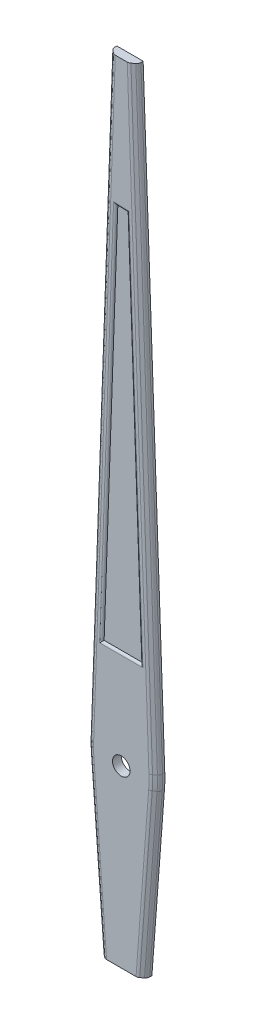
ISO-10303-21;
HEADER;
FILE_DESCRIPTION(('STEP AP214'),'2;1');
FILE_NAME('part.step','',(''),(''),'','','');
FILE_SCHEMA(('AUTOMOTIVE_DESIGN { 1 0 10303 214 1 1 1 1 }'));
ENDSEC;
DATA;
#1=APPLICATION_CONTEXT('core data for automotive mechanical design processes');
#2=APPLICATION_PROTOCOL_DEFINITION('international standard','automotive_design',2000,#1);
#3=PRODUCT_CONTEXT('',#1,'mechanical');
#4=PRODUCT('Part','Part','',(#3));
#5=PRODUCT_RELATED_PRODUCT_CATEGORY('part','',(#4));
#6=PRODUCT_DEFINITION_FORMATION('','',#4);
#7=PRODUCT_DEFINITION_CONTEXT('part definition',#1,'design');
#8=PRODUCT_DEFINITION('design','',#6,#7);
#9=PRODUCT_DEFINITION_SHAPE('','',#8);
#10=(LENGTH_UNIT() NAMED_UNIT(*) SI_UNIT(.MILLI.,.METRE.));
#11=(NAMED_UNIT(*) PLANE_ANGLE_UNIT() SI_UNIT($,.RADIAN.));
#12=(NAMED_UNIT(*) SI_UNIT($,.STERADIAN.) SOLID_ANGLE_UNIT());
#13=UNCERTAINTY_MEASURE_WITH_UNIT(LENGTH_MEASURE(1.E-05),#10,'distance_accuracy_value','');
#14=(GEOMETRIC_REPRESENTATION_CONTEXT(3) GLOBAL_UNCERTAINTY_ASSIGNED_CONTEXT((#13)) GLOBAL_UNIT_ASSIGNED_CONTEXT((#10,
#11,#12)) REPRESENTATION_CONTEXT('',''));
#15=CARTESIAN_POINT('',(0.,0.,0.));
#16=DIRECTION('',(0.,0.,1.));
#17=DIRECTION('',(1.,0.,0.));
#18=AXIS2_PLACEMENT_3D('',#15,#16,#17);
#19=CARTESIAN_POINT('',(-2.20401362734664,0.058827208974585,0.2));
#20=DIRECTION('',(0.,0.,1.));
#21=DIRECTION('',(1.,0.,0.));
#22=AXIS2_PLACEMENT_3D('',#19,#20,#21);
#23=PLANE('',#22);
#24=DIRECTION('',(-0.0356915305124125,-0.99936285434755,0.));
#25=VECTOR('',#24,1.);
#26=CARTESIAN_POINT('',(-0.177800696297226,11.0336739066205,0.2));
#27=LINE('',#26,#25);
#28=CARTESIAN_POINT('',(-0.493646192962242,2.19,0.2));
#29=VERTEX_POINT('',#28);
#30=CARTESIAN_POINT('',(-0.176016119771606,11.0836420493378,0.2));
#31=VERTEX_POINT('',#30);
#32=EDGE_CURVE('E366',#29,#31,#27,.F.);
#33=ORIENTED_EDGE('',*,*,#32,.T.);
#34=DIRECTION('',(-0.99936285434755,0.0356915305124137,0.));
#35=VECTOR('',#34,1.);
#36=CARTESIAN_POINT('',(0.129943650037985,11.0727149147018,0.2));
#37=LINE('',#36,#35);
#38=CARTESIAN_POINT('',(0.176465713947268,11.0710534124193,0.2));
#39=VERTEX_POINT('',#38);
#40=EDGE_CURVE('E11',#31,#39,#37,.F.);
#41=ORIENTED_EDGE('',*,*,#40,.T.);
#42=DIRECTION('',(-0.0356915305124124,0.99936285434755,0.));
#43=VECTOR('',#42,1.);
#44=CARTESIAN_POINT('',(0.491796743800613,2.24178457652562,0.2));
#45=LINE('',#44,#43);
#46=CARTESIAN_POINT('',(0.493646192962242,2.19,0.2));
#47=VERTEX_POINT('',#46);
#48=EDGE_CURVE('E45',#39,#47,#45,.F.);
#49=ORIENTED_EDGE('',*,*,#48,.T.);
#50=DIRECTION('',(1.,0.,0.));
#51=VECTOR('',#50,1.);
#52=CARTESIAN_POINT('',(-0.441828601083235,2.19,0.2));
#53=LINE('',#52,#51);
#54=EDGE_CURVE('E212',#47,#29,#53,.F.);
#55=ORIENTED_EDGE('',*,*,#54,.T.);
#56=EDGE_LOOP('',(#33,#41,#49,#55));
#57=FACE_BOUND('',#56,.T.);
#58=CARTESIAN_POINT('',(2.20401362734664,0.0588272089745885,0.2));
#59=DIRECTION('',(0.,0.,1.));
#60=DIRECTION('',(1.,0.,0.));
#61=AXIS2_PLACEMENT_3D('',#58,#59,#60);
#62=CIRCLE('',#61,2.83757307545173);
#63=CARTESIAN_POINT('',(-0.631751500756547,0.160104534978286,0.2));
#64=VERTEX_POINT('',#63);
#65=CARTESIAN_POINT('',(-0.625612285251882,-0.153394734470307,0.2));
#66=VERTEX_POINT('',#65);
#67=EDGE_CURVE('E328',#64,#66,#62,.T.);
#68=ORIENTED_EDGE('',*,*,#67,.T.);
#69=DIRECTION('',(0.0747899482416342,-0.997199309888457,0.));
#70=VECTOR('',#69,1.);
#71=CARTESIAN_POINT('',(-0.650268745968003,0.175358075077983,0.2));
#72=LINE('',#71,#70);
#73=CARTESIAN_POINT('',(-0.337116890337154,-4.,0.2));
#74=VERTEX_POINT('',#73);
#75=EDGE_CURVE('E330',#66,#74,#72,.T.);
#76=ORIENTED_EDGE('',*,*,#75,.T.);
#77=DIRECTION('',(1.,0.,0.));
#78=VECTOR('',#77,1.);
#79=CARTESIAN_POINT('',(-0.5,-4.,0.2));
#80=LINE('',#79,#78);
#81=CARTESIAN_POINT('',(0.337116890337155,-4.,0.2));
#82=VERTEX_POINT('',#81);
#83=EDGE_CURVE('E234',#74,#82,#80,.T.);
#84=ORIENTED_EDGE('',*,*,#83,.T.);
#85=DIRECTION('',(0.0747899482416343,0.997199309888456,0.));
#86=VECTOR('',#85,1.);
#87=CARTESIAN_POINT('',(0.625612285251883,-0.153394734470305,0.2));
#88=LINE('',#87,#86);
#89=CARTESIAN_POINT('',(0.625612285251882,-0.153394734470312,0.2));
#90=VERTEX_POINT('',#89);
#91=EDGE_CURVE('E323',#82,#90,#88,.T.);
#92=ORIENTED_EDGE('',*,*,#91,.T.);
#93=CARTESIAN_POINT('',(-2.20401362734664,0.058827208974585,0.2));
#94=DIRECTION('',(0.,0.,1.));
#95=DIRECTION('',(1.,0.,0.));
#96=AXIS2_PLACEMENT_3D('',#93,#94,#95);
#97=CIRCLE('',#96,2.83757307545173);
#98=CARTESIAN_POINT('',(0.631751500756548,0.160104534978283,0.2));
#99=VERTEX_POINT('',#98);
#100=EDGE_CURVE('E321',#90,#99,#97,.T.);
#101=ORIENTED_EDGE('',*,*,#100,.T.);
#102=DIRECTION('',(-0.0356915305124125,0.99936285434755,0.));
#103=VECTOR('',#102,1.);
#104=CARTESIAN_POINT('',(0.631751500756549,0.16010453497827,0.2));
#105=LINE('',#104,#103);
#106=CARTESIAN_POINT('',(0.137469519862915,14.,0.2));
#107=VERTEX_POINT('',#106);
#108=EDGE_CURVE('E319',#99,#107,#105,.T.);
#109=ORIENTED_EDGE('',*,*,#108,.T.);
#110=DIRECTION('',(-1.,0.,0.));
#111=VECTOR('',#110,1.);
#112=CARTESIAN_POINT('',(-0.3,14.,0.2));
#113=LINE('',#112,#111);
#114=CARTESIAN_POINT('',(-0.137469519862915,14.,0.2));
#115=VERTEX_POINT('',#114);
#116=EDGE_CURVE('E231',#107,#115,#113,.T.);
#117=ORIENTED_EDGE('',*,*,#116,.T.);
#118=DIRECTION('',(-0.0356915305124125,-0.99936285434755,0.));
#119=VECTOR('',#118,1.);
#120=CARTESIAN_POINT('',(-0.637366822100106,0.00287553735863727,0.2));
#121=LINE('',#120,#119);
#122=EDGE_CURVE('E326',#115,#64,#121,.T.);
#123=ORIENTED_EDGE('',*,*,#122,.T.);
#124=EDGE_LOOP('',(#68,#76,#84,#92,#101,#109,#117,#123));
#125=FACE_BOUND('',#124,.T.);
#126=CARTESIAN_POINT('',(0.,0.,0.2));
#127=DIRECTION('',(0.,0.,1.));
#128=DIRECTION('',(1.,0.,0.));
#129=AXIS2_PLACEMENT_3D('',#126,#127,#128);
#130=CIRCLE('',#129,0.2);
#131=CARTESIAN_POINT('',(0.2,0.,0.2));
#132=VERTEX_POINT('',#131);
#133=EDGE_CURVE('E223',#132,#132,#130,.T.);
#134=ORIENTED_EDGE('',*,*,#133,.F.);
#135=EDGE_LOOP('',(#134));
#136=FACE_BOUND('',#135,.T.);
#137=ADVANCED_FACE('F36',(#57,#125,#136),#23,.T.);
#138=CARTESIAN_POINT('',(-2.20401362734664,0.058827208974585,0.));
#139=DIRECTION('',(0.,0.,1.));
#140=DIRECTION('',(1.,0.,0.));
#141=AXIS2_PLACEMENT_3D('',#138,#139,#140);
#142=PLANE('',#141);
#143=DIRECTION('',(-1.,0.,0.));
#144=VECTOR('',#143,1.);
#145=CARTESIAN_POINT('',(-0.3,14.,0.));
#146=LINE('',#145,#144);
#147=CARTESIAN_POINT('',(0.3,14.,0.));
#148=VERTEX_POINT('',#147);
#149=CARTESIAN_POINT('',(-0.3,14.,0.));
#150=VERTEX_POINT('',#149);
#151=EDGE_CURVE('E226',#148,#150,#146,.T.);
#152=ORIENTED_EDGE('',*,*,#151,.F.);
#153=DIRECTION('',(-0.0356915305124125,0.99936285434755,0.));
#154=VECTOR('',#153,1.);
#155=CARTESIAN_POINT('',(0.794074935696006,0.165901800511836,0.));
#156=LINE('',#155,#154);
#157=CARTESIAN_POINT('',(0.794074935696005,0.165901800511835,0.));
#158=VERTEX_POINT('',#157);
#159=EDGE_CURVE('E235',#158,#148,#156,.T.);
#160=ORIENTED_EDGE('',*,*,#159,.F.);
#161=CARTESIAN_POINT('',(-2.20401362734664,0.058827208974585,0.));
#162=DIRECTION('',(0.,0.,1.));
#163=DIRECTION('',(1.,0.,0.));
#164=AXIS2_PLACEMENT_3D('',#161,#162,#163);
#165=CIRCLE('',#164,3.);
#166=CARTESIAN_POINT('',(0.787584302318726,-0.165542635750325,0.));
#167=VERTEX_POINT('',#166);
#168=EDGE_CURVE('E256',#167,#158,#165,.T.);
#169=ORIENTED_EDGE('',*,*,#168,.F.);
#170=DIRECTION('',(0.0747899482416343,0.997199309888456,0.));
#171=VECTOR('',#170,1.);
#172=CARTESIAN_POINT('',(0.787584302318726,-0.165542635750325,0.));
#173=LINE('',#172,#171);
#174=CARTESIAN_POINT('',(0.5,-4.,0.));
#175=VERTEX_POINT('',#174);
#176=EDGE_CURVE('E253',#175,#167,#173,.T.);
#177=ORIENTED_EDGE('',*,*,#176,.F.);
#178=DIRECTION('',(1.,0.,0.));
#179=VECTOR('',#178,1.);
#180=CARTESIAN_POINT('',(-0.5,-4.,0.));
#181=LINE('',#180,#179);
#182=CARTESIAN_POINT('',(-0.5,-4.,0.));
#183=VERTEX_POINT('',#182);
#184=EDGE_CURVE('E250',#183,#175,#181,.T.);
#185=ORIENTED_EDGE('',*,*,#184,.F.);
#186=DIRECTION('',(0.0747899482416342,-0.997199309888456,0.));
#187=VECTOR('',#186,1.);
#188=CARTESIAN_POINT('',(-0.787584302318726,-0.165542635750322,0.));
#189=LINE('',#188,#187);
#190=CARTESIAN_POINT('',(-0.787584302318726,-0.165542635750321,0.));
#191=VERTEX_POINT('',#190);
#192=EDGE_CURVE('E247',#191,#183,#189,.T.);
#193=ORIENTED_EDGE('',*,*,#192,.F.);
#194=CARTESIAN_POINT('',(2.20401362734664,0.0588272089745885,0.));
#195=DIRECTION('',(0.,0.,1.));
#196=DIRECTION('',(1.,0.,0.));
#197=AXIS2_PLACEMENT_3D('',#194,#195,#196);
#198=CIRCLE('',#197,3.);
#199=CARTESIAN_POINT('',(-0.794074935696006,0.165901800511839,0.));
#200=VERTEX_POINT('',#199);
#201=EDGE_CURVE('E244',#200,#191,#198,.T.);
#202=ORIENTED_EDGE('',*,*,#201,.F.);
#203=DIRECTION('',(-0.0356915305124125,-0.999362854347549,0.));
#204=VECTOR('',#203,1.);
#205=CARTESIAN_POINT('',(-0.794074935696006,0.165901800511839,0.));
#206=LINE('',#205,#204);
#207=EDGE_CURVE('E241',#150,#200,#206,.T.);
#208=ORIENTED_EDGE('',*,*,#207,.F.);
#209=EDGE_LOOP('',(#152,#160,#169,#177,#185,#193,#202,#208));
#210=FACE_BOUND('',#209,.T.);
#211=CARTESIAN_POINT('',(0.,0.,0.));
#212=DIRECTION('',(0.,0.,1.));
#213=DIRECTION('',(1.,0.,0.));
#214=AXIS2_PLACEMENT_3D('',#211,#212,#213);
#215=CIRCLE('',#214,0.2);
#216=CARTESIAN_POINT('',(0.2,0.,0.));
#217=VERTEX_POINT('',#216);
#218=EDGE_CURVE('E227',#217,#217,#215,.T.);
#219=ORIENTED_EDGE('',*,*,#218,.T.);
#220=EDGE_LOOP('',(#219));
#221=FACE_BOUND('',#220,.T.);
#222=ADVANCED_FACE('F406',(#210,#221),#142,.F.);
#223=CARTESIAN_POINT('',(-0.3,14.,0.2));
#224=DIRECTION('',(0.,-1.,0.));
#225=DIRECTION('',(0.,0.,-1.));
#226=AXIS2_PLACEMENT_3D('',#223,#224,#225);
#227=PLANE('',#226);
#228=DIRECTION('',(0.,0.,-1.));
#229=VECTOR('',#228,1.);
#230=CARTESIAN_POINT('',(-0.3,14.,0.2));
#231=LINE('',#230,#229);
#232=CARTESIAN_POINT('',(-0.3,14.,0.0512267411434129));
#233=VERTEX_POINT('',#232);
#234=EDGE_CURVE('E274',#233,#150,#231,.T.);
#235=ORIENTED_EDGE('',*,*,#234,.F.);
#236=CARTESIAN_POINT('',(-0.199936244813415,14.,0.0512267411434129));
#237=DIRECTION('',(0.,-1.,0.));
#238=DIRECTION('',(-1.,0.,0.));
#239=AXIS2_PLACEMENT_3D('',#236,#237,#238);
#240=ELLIPSE('',#239,0.100063755186585,0.1);
#241=CARTESIAN_POINT('',(-0.261541643958214,14.,0.130027816504085));
#242=VERTEX_POINT('',#241);
#243=EDGE_CURVE('E354',#233,#242,#240,.F.);
#244=ORIENTED_EDGE('',*,*,#243,.T.);
#245=DIRECTION('',(0.788201068930883,0.,0.615417805182961));
#246=VECTOR('',#245,1.);
#247=CARTESIAN_POINT('',(-0.482463626303815,14.,-0.0424653795229318));
#248=LINE('',#247,#246);
#249=CARTESIAN_POINT('',(-0.199074919007713,14.,0.178801075360672));
#250=VERTEX_POINT('',#249);
#251=EDGE_CURVE('E282',#242,#250,#248,.T.);
#252=ORIENTED_EDGE('',*,*,#251,.T.);
#253=CARTESIAN_POINT('',(-0.137469519862915,14.,0.1));
#254=DIRECTION('',(0.,-1.,0.));
#255=DIRECTION('',(-1.,0.,0.));
#256=AXIS2_PLACEMENT_3D('',#253,#254,#255);
#257=ELLIPSE('',#256,0.100063755186585,0.1);
#258=EDGE_CURVE('E352',#250,#115,#257,.F.);
#259=ORIENTED_EDGE('',*,*,#258,.T.);
#260=ORIENTED_EDGE('',*,*,#116,.F.);
#261=CARTESIAN_POINT('',(0.137469519862915,14.,0.1));
#262=DIRECTION('',(0.,-1.,0.));
#263=DIRECTION('',(-1.,0.,0.));
#264=AXIS2_PLACEMENT_3D('',#261,#262,#263);
#265=ELLIPSE('',#264,0.100063755186585,0.1);
#266=CARTESIAN_POINT('',(0.199074919007714,14.,0.178801075360672));
#267=VERTEX_POINT('',#266);
#268=EDGE_CURVE('E348',#107,#267,#265,.F.);
#269=ORIENTED_EDGE('',*,*,#268,.T.);
#270=DIRECTION('',(0.788201068930883,0.,-0.615417805182961));
#271=VECTOR('',#270,1.);
#272=CARTESIAN_POINT('',(0.478975046571386,14.,-0.0397415389107265));
#273=LINE('',#272,#271);
#274=CARTESIAN_POINT('',(0.261541643958214,14.,0.130027816504085));
#275=VERTEX_POINT('',#274);
#276=EDGE_CURVE('E285',#267,#275,#273,.T.);
#277=ORIENTED_EDGE('',*,*,#276,.T.);
#278=CARTESIAN_POINT('',(0.199936244813415,14.,0.0512267411434129));
#279=DIRECTION('',(0.,-1.,0.));
#280=DIRECTION('',(-1.,0.,0.));
#281=AXIS2_PLACEMENT_3D('',#278,#279,#280);
#282=ELLIPSE('',#281,0.100063755186585,0.1);
#283=CARTESIAN_POINT('',(0.3,14.,0.0512267411434129));
#284=VERTEX_POINT('',#283);
#285=EDGE_CURVE('E350',#275,#284,#282,.F.);
#286=ORIENTED_EDGE('',*,*,#285,.T.);
#287=DIRECTION('',(0.,0.,-1.));
#288=VECTOR('',#287,1.);
#289=CARTESIAN_POINT('',(0.3,14.,0.2));
#290=LINE('',#289,#288);
#291=EDGE_CURVE('E238',#284,#148,#290,.T.);
#292=ORIENTED_EDGE('',*,*,#291,.T.);
#293=ORIENTED_EDGE('',*,*,#151,.T.);
#294=EDGE_LOOP('',(#235,#244,#252,#259,#260,#269,#277,#286,#292,#293));
#295=FACE_BOUND('',#294,.T.);
#296=ADVANCED_FACE('F411',(#295),#227,.F.);
#297=CARTESIAN_POINT('',(-0.794074935696006,0.165901800511839,0.2));
#298=DIRECTION('',(0.999362854347549,-0.0356915305124125,0.));
#299=DIRECTION('',(0.0356915305124125,0.99936285434755,0.));
#300=AXIS2_PLACEMENT_3D('',#297,#298,#299);
#301=PLANE('',#300);
#302=DIRECTION('',(0.,0.,-1.));
#303=VECTOR('',#302,1.);
#304=CARTESIAN_POINT('',(-0.794074935696006,0.165901800511839,0.2));
#305=LINE('',#304,#303);
#306=CARTESIAN_POINT('',(-0.794074935696006,0.165901800511839,0.0512267411434129));
#307=VERTEX_POINT('',#306);
#308=EDGE_CURVE('E272',#307,#200,#305,.T.);
#309=ORIENTED_EDGE('',*,*,#308,.F.);
#310=DIRECTION('',(0.0356915305124125,0.99936285434755,0.));
#311=VECTOR('',#310,1.);
#312=CARTESIAN_POINT('',(-0.3,14.,0.0512267411434129));
#313=LINE('',#312,#311);
#314=EDGE_CURVE('E346',#307,#233,#313,.T.);
#315=ORIENTED_EDGE('',*,*,#314,.T.);
#316=ORIENTED_EDGE('',*,*,#234,.T.);
#317=ORIENTED_EDGE('',*,*,#207,.T.);
#318=EDGE_LOOP('',(#309,#315,#316,#317));
#319=FACE_BOUND('',#318,.T.);
#320=ADVANCED_FACE('F441',(#319),#301,.F.);
#321=CARTESIAN_POINT('',(2.20401362734664,0.0588272089745885,0.2));
#322=DIRECTION('',(0.,0.,-1.));
#323=DIRECTION('',(-1.,0.,0.));
#324=AXIS2_PLACEMENT_3D('',#321,#322,#323);
#325=CYLINDRICAL_SURFACE('',#324,3.);
#326=DIRECTION('',(0.,0.,-1.));
#327=VECTOR('',#326,1.);
#328=CARTESIAN_POINT('',(-0.787584302318726,-0.165542635750321,0.2));
#329=LINE('',#328,#327);
#330=CARTESIAN_POINT('',(-0.787584302318726,-0.165542635750321,0.0512267411434131));
#331=VERTEX_POINT('',#330);
#332=EDGE_CURVE('E270',#331,#191,#329,.T.);
#333=ORIENTED_EDGE('',*,*,#332,.F.);
#334=CARTESIAN_POINT('',(2.20401362734664,0.0588272089745885,0.0512267411434131));
#335=DIRECTION('',(0.,0.,1.));
#336=DIRECTION('',(1.,0.,0.));
#337=AXIS2_PLACEMENT_3D('',#334,#335,#336);
#338=CIRCLE('',#337,3.);
#339=EDGE_CURVE('E313',#331,#307,#338,.F.);
#340=ORIENTED_EDGE('',*,*,#339,.T.);
#341=ORIENTED_EDGE('',*,*,#308,.T.);
#342=ORIENTED_EDGE('',*,*,#201,.T.);
#343=EDGE_LOOP('',(#333,#340,#341,#342));
#344=FACE_BOUND('',#343,.T.);
#345=ADVANCED_FACE('F437',(#344),#325,.T.);
#346=CARTESIAN_POINT('',(-0.787584302318726,-0.165542635750322,0.2));
#347=DIRECTION('',(0.997199309888456,0.0747899482416342,0.));
#348=DIRECTION('',(-0.0747899482416342,0.997199309888456,0.));
#349=AXIS2_PLACEMENT_3D('',#346,#347,#348);
#350=PLANE('',#349);
#351=DIRECTION('',(0.,0.,-1.));
#352=VECTOR('',#351,1.);
#353=CARTESIAN_POINT('',(-0.5,-4.,0.2));
#354=LINE('',#353,#352);
#355=CARTESIAN_POINT('',(-0.5,-4.,0.0512267411434129));
#356=VERTEX_POINT('',#355);
#357=EDGE_CURVE('E268',#356,#183,#354,.T.);
#358=ORIENTED_EDGE('',*,*,#357,.F.);
#359=DIRECTION('',(-0.0747899482416342,0.997199309888456,0.));
#360=VECTOR('',#359,1.);
#361=CARTESIAN_POINT('',(-0.787584302318726,-0.165542635750321,0.0512267411434129));
#362=LINE('',#361,#360);
#363=EDGE_CURVE('E288',#356,#331,#362,.T.);
#364=ORIENTED_EDGE('',*,*,#363,.T.);
#365=ORIENTED_EDGE('',*,*,#332,.T.);
#366=ORIENTED_EDGE('',*,*,#192,.T.);
#367=EDGE_LOOP('',(#358,#364,#365,#366));
#368=FACE_BOUND('',#367,.T.);
#369=ADVANCED_FACE('F433',(#368),#350,.F.);
#370=CARTESIAN_POINT('',(-0.5,-4.,0.2));
#371=DIRECTION('',(0.,1.,0.));
#372=DIRECTION('',(0.,0.,1.));
#373=AXIS2_PLACEMENT_3D('',#370,#371,#372);
#374=PLANE('',#373);
#375=DIRECTION('',(-0.788847442157948,0.,-0.614589060267805));
#376=VECTOR('',#375,1.);
#377=CARTESIAN_POINT('',(-0.566394396245892,-4.,0.0482722926955477));
#378=LINE('',#377,#376);
#379=CARTESIAN_POINT('',(-0.398855949843175,-4.,0.178801075360672));
#380=VERTEX_POINT('',#379);
#381=CARTESIAN_POINT('',(-0.461458203905363,-4.,0.130027816504085));
#382=VERTEX_POINT('',#381);
#383=EDGE_CURVE('E276',#380,#382,#378,.T.);
#384=ORIENTED_EDGE('',*,*,#383,.T.);
#385=CARTESIAN_POINT('',(-0.399719144399342,-4.,0.0512267411434129));
#386=DIRECTION('',(0.,1.,0.));
#387=DIRECTION('',(1.,0.,0.));
#388=AXIS2_PLACEMENT_3D('',#385,#386,#387);
#389=ELLIPSE('',#388,0.100280855600658,0.1);
#390=EDGE_CURVE('E311',#382,#356,#389,.F.);
#391=ORIENTED_EDGE('',*,*,#390,.T.);
#392=ORIENTED_EDGE('',*,*,#357,.T.);
#393=ORIENTED_EDGE('',*,*,#184,.T.);
#394=DIRECTION('',(0.,0.,-1.));
#395=VECTOR('',#394,1.);
#396=CARTESIAN_POINT('',(0.5,-4.,0.2));
#397=LINE('',#396,#395);
#398=CARTESIAN_POINT('',(0.5,-4.,0.051226741143413));
#399=VERTEX_POINT('',#398);
#400=EDGE_CURVE('E266',#399,#175,#397,.T.);
#401=ORIENTED_EDGE('',*,*,#400,.F.);
#402=CARTESIAN_POINT('',(0.399719144399342,-4.,0.051226741143413));
#403=DIRECTION('',(0.,1.,0.));
#404=DIRECTION('',(1.,0.,0.));
#405=AXIS2_PLACEMENT_3D('',#402,#403,#404);
#406=ELLIPSE('',#405,0.100280855600658,0.1);
#407=CARTESIAN_POINT('',(0.461458203905363,-4.,0.130027816504085));
#408=VERTEX_POINT('',#407);
#409=EDGE_CURVE('E307',#399,#408,#406,.F.);
#410=ORIENTED_EDGE('',*,*,#409,.T.);
#411=DIRECTION('',(-0.788847442157947,0.,0.614589060267805));
#412=VECTOR('',#411,1.);
#413=CARTESIAN_POINT('',(0.551051166795081,-4.,0.0602261642120114));
#414=LINE('',#413,#412);
#415=CARTESIAN_POINT('',(0.398855949843175,-4.,0.178801075360672));
#416=VERTEX_POINT('',#415);
#417=EDGE_CURVE('E279',#408,#416,#414,.T.);
#418=ORIENTED_EDGE('',*,*,#417,.T.);
#419=CARTESIAN_POINT('',(0.337116890337155,-4.,0.1));
#420=DIRECTION('',(0.,1.,0.));
#421=DIRECTION('',(1.,0.,0.));
#422=AXIS2_PLACEMENT_3D('',#419,#420,#421);
#423=ELLIPSE('',#422,0.100280855600658,0.1);
#424=EDGE_CURVE('E305',#416,#82,#423,.F.);
#425=ORIENTED_EDGE('',*,*,#424,.T.);
#426=ORIENTED_EDGE('',*,*,#83,.F.);
#427=CARTESIAN_POINT('',(-0.337116890337154,-4.,0.1));
#428=DIRECTION('',(0.,1.,0.));
#429=DIRECTION('',(1.,0.,0.));
#430=AXIS2_PLACEMENT_3D('',#427,#428,#429);
#431=ELLIPSE('',#430,0.100280855600658,0.1);
#432=EDGE_CURVE('E309',#74,#380,#431,.F.);
#433=ORIENTED_EDGE('',*,*,#432,.T.);
#434=EDGE_LOOP('',(#384,#391,#392,#393,#401,#410,#418,#425,#426,#433));
#435=FACE_BOUND('',#434,.T.);
#436=ADVANCED_FACE('F429',(#435),#374,.F.);
#437=CARTESIAN_POINT('',(0.787584302318726,-0.165542635750325,0.2));
#438=DIRECTION('',(-0.997199309888456,0.0747899482416343,0.));
#439=DIRECTION('',(-0.0747899482416343,-0.997199309888456,0.));
#440=AXIS2_PLACEMENT_3D('',#437,#438,#439);
#441=PLANE('',#440);
#442=DIRECTION('',(0.,0.,-1.));
#443=VECTOR('',#442,1.);
#444=CARTESIAN_POINT('',(0.787584302318726,-0.165542635750325,0.2));
#445=LINE('',#444,#443);
#446=CARTESIAN_POINT('',(0.787584302318726,-0.165542635750325,0.051226741143413));
#447=VERTEX_POINT('',#446);
#448=EDGE_CURVE('E264',#447,#167,#445,.T.);
#449=ORIENTED_EDGE('',*,*,#448,.F.);
#450=DIRECTION('',(-0.0747899482416343,-0.997199309888456,0.));
#451=VECTOR('',#450,1.);
#452=CARTESIAN_POINT('',(0.5,-4.,0.051226741143413));
#453=LINE('',#452,#451);
#454=EDGE_CURVE('E333',#447,#399,#453,.T.);
#455=ORIENTED_EDGE('',*,*,#454,.T.);
#456=ORIENTED_EDGE('',*,*,#400,.T.);
#457=ORIENTED_EDGE('',*,*,#176,.T.);
#458=EDGE_LOOP('',(#449,#455,#456,#457));
#459=FACE_BOUND('',#458,.T.);
#460=ADVANCED_FACE('F425',(#459),#441,.F.);
#461=CARTESIAN_POINT('',(-2.20401362734664,0.058827208974585,0.2));
#462=DIRECTION('',(0.,0.,-1.));
#463=DIRECTION('',(-1.,0.,0.));
#464=AXIS2_PLACEMENT_3D('',#461,#462,#463);
#465=CYLINDRICAL_SURFACE('',#464,3.);
#466=DIRECTION('',(0.,0.,-1.));
#467=VECTOR('',#466,1.);
#468=CARTESIAN_POINT('',(0.794074935696005,0.165901800511835,0.2));
#469=LINE('',#468,#467);
#470=CARTESIAN_POINT('',(0.794074935696005,0.165901800511835,0.0512267411434129));
#471=VERTEX_POINT('',#470);
#472=EDGE_CURVE('E262',#471,#158,#469,.T.);
#473=ORIENTED_EDGE('',*,*,#472,.F.);
#474=CARTESIAN_POINT('',(-2.20401362734664,0.058827208974585,0.051226741143413));
#475=DIRECTION('',(0.,0.,1.));
#476=DIRECTION('',(1.,0.,0.));
#477=AXIS2_PLACEMENT_3D('',#474,#475,#476);
#478=CIRCLE('',#477,3.);
#479=EDGE_CURVE('E340',#471,#447,#478,.F.);
#480=ORIENTED_EDGE('',*,*,#479,.T.);
#481=ORIENTED_EDGE('',*,*,#448,.T.);
#482=ORIENTED_EDGE('',*,*,#168,.T.);
#483=EDGE_LOOP('',(#473,#480,#481,#482));
#484=FACE_BOUND('',#483,.T.);
#485=ADVANCED_FACE('F421',(#484),#465,.T.);
#486=CARTESIAN_POINT('',(0.794074935696006,0.165901800511836,0.2));
#487=DIRECTION('',(-0.99936285434755,-0.0356915305124125,0.));
#488=DIRECTION('',(0.0356915305124125,-0.99936285434755,0.));
#489=AXIS2_PLACEMENT_3D('',#486,#487,#488);
#490=PLANE('',#489);
#491=ORIENTED_EDGE('',*,*,#291,.F.);
#492=DIRECTION('',(0.0356915305124125,-0.99936285434755,0.));
#493=VECTOR('',#492,1.);
#494=CARTESIAN_POINT('',(0.794074935696006,0.165901800511835,0.0512267411434129));
#495=LINE('',#494,#493);
#496=EDGE_CURVE('E360',#284,#471,#495,.T.);
#497=ORIENTED_EDGE('',*,*,#496,.T.);
#498=ORIENTED_EDGE('',*,*,#472,.T.);
#499=ORIENTED_EDGE('',*,*,#159,.T.);
#500=EDGE_LOOP('',(#491,#497,#498,#499));
#501=FACE_BOUND('',#500,.T.);
#502=ADVANCED_FACE('F418',(#501),#490,.F.);
#503=CARTESIAN_POINT('',(0.,0.,0.2));
#504=DIRECTION('',(0.,0.,-1.));
#505=DIRECTION('',(-1.,0.,0.));
#506=AXIS2_PLACEMENT_3D('',#503,#504,#505);
#507=CYLINDRICAL_SURFACE('',#506,0.2);
#508=ORIENTED_EDGE('',*,*,#133,.T.);
#509=EDGE_LOOP('',(#508));
#510=FACE_BOUND('',#509,.T.);
#511=ORIENTED_EDGE('',*,*,#218,.F.);
#512=EDGE_LOOP('',(#511));
#513=FACE_BOUND('',#512,.T.);
#514=ADVANCED_FACE('F415',(#510,#513),#507,.F.);
#515=CARTESIAN_POINT('',(0.666162323401332,0.16133349292987,0.2));
#516=DIRECTION('',(0.615269209293275,0.0219739003319027,0.78801075360672));
#517=DIRECTION('',(0.0356915305124125,-0.99936285434755,0.));
#518=AXIS2_PLACEMENT_3D('',#515,#516,#517);
#519=PLANE('',#518);
#520=DIRECTION('',(-0.787508675980976,-0.0281253098564667,0.61566147532566));
#521=VECTOR('',#520,1.);
#522=CARTESIAN_POINT('',(0.794074935696006,0.165901800511835,0.0999999999999989));
#523=LINE('',#522,#521);
#524=CARTESIAN_POINT('',(0.755665571190578,0.164530037493784,0.130027816504085));
#525=VERTEX_POINT('',#524);
#526=CARTESIAN_POINT('',(0.693278421685875,0.162301925011473,0.178801075360672));
#527=VERTEX_POINT('',#526);
#528=EDGE_CURVE('E230',#525,#527,#523,.T.);
#529=ORIENTED_EDGE('',*,*,#528,.F.);
#530=DIRECTION('',(0.0356915305124125,-0.99936285434755,0.));
#531=VECTOR('',#530,1.);
#532=CARTESIAN_POINT('',(0.261590635494572,13.998628236982,0.130027816504085));
#533=LINE('',#532,#531);
#534=EDGE_CURVE('E364',#525,#275,#533,.F.);
#535=ORIENTED_EDGE('',*,*,#534,.T.);
#536=ORIENTED_EDGE('',*,*,#276,.F.);
#537=DIRECTION('',(-0.0356915305124125,0.99936285434755,0.));
#538=VECTOR('',#537,1.);
#539=CARTESIAN_POINT('',(0.693278421685876,0.162301925011461,0.178801075360672));
#540=LINE('',#539,#538);
#541=EDGE_CURVE('E362',#267,#527,#540,.F.);
#542=ORIENTED_EDGE('',*,*,#541,.T.);
#543=EDGE_LOOP('',(#529,#535,#536,#542));
#544=FACE_BOUND('',#543,.T.);
#545=ADVANCED_FACE('F457',(#544),#519,.T.);
#546=CARTESIAN_POINT('',(-2.20401362734664,0.058827208974585,0.2));
#547=DIRECTION('',(0.,0.,-1.));
#548=DIRECTION('',(-1.,0.,0.));
#549=AXIS2_PLACEMENT_3D('',#546,#547,#548);
#550=CONICAL_SURFACE('',#549,2.87200583678069,0.907571211037048);
#551=DIRECTION('',(-0.785803779681303,0.0589352834760979,0.615661475325661));
#552=VECTOR('',#551,1.);
#553=CARTESIAN_POINT('',(0.787584302318726,-0.165542635750325,0.0999999999999989));
#554=LINE('',#553,#552);
#555=CARTESIAN_POINT('',(0.749258091161846,-0.162668169913559,0.130027816504085));
#556=VERTEX_POINT('',#555);
#557=CARTESIAN_POINT('',(0.687006005083847,-0.15799926345771,0.178801075360672));
#558=VERTEX_POINT('',#557);
#559=EDGE_CURVE('E289',#556,#558,#554,.T.);
#560=ORIENTED_EDGE('',*,*,#559,.F.);
#561=CARTESIAN_POINT('',(-2.20401362734664,0.058827208974585,0.130027816504085));
#562=DIRECTION('',(0.,0.,-1.));
#563=DIRECTION('',(-1.,0.,0.));
#564=AXIS2_PLACEMENT_3D('',#561,#562,#563);
#565=CIRCLE('',#564,2.96156614753257);
#566=EDGE_CURVE('E344',#556,#525,#565,.F.);
#567=ORIENTED_EDGE('',*,*,#566,.T.);
#568=ORIENTED_EDGE('',*,*,#528,.T.);
#569=CARTESIAN_POINT('',(-2.20401362734664,0.058827208974585,0.178801075360671));
#570=DIRECTION('',(0.,0.,1.));
#571=DIRECTION('',(1.,0.,0.));
#572=AXIS2_PLACEMENT_3D('',#569,#570,#571);
#573=CIRCLE('',#572,2.89913922298429);
#574=EDGE_CURVE('E342',#527,#558,#573,.F.);
#575=ORIENTED_EDGE('',*,*,#574,.T.);
#576=EDGE_LOOP('',(#560,#567,#568,#575));
#577=FACE_BOUND('',#576,.T.);
#578=ADVANCED_FACE('F453',(#577),#550,.T.);
#579=CARTESIAN_POINT('',(0.659948611086682,-0.155969958907914,0.2));
#580=DIRECTION('',(0.613937198319658,-0.0460452898739744,0.78801075360672));
#581=DIRECTION('',(-0.0747899482416343,-0.997199309888456,0.));
#582=AXIS2_PLACEMENT_3D('',#579,#580,#581);
#583=PLANE('',#582);
#584=ORIENTED_EDGE('',*,*,#417,.F.);
#585=DIRECTION('',(-0.0747899482416343,-0.997199309888457,0.));
#586=VECTOR('',#585,1.);
#587=CARTESIAN_POINT('',(0.749258091161846,-0.162668169913559,0.130027816504085));
#588=LINE('',#587,#586);
#589=EDGE_CURVE('E338',#408,#556,#588,.F.);
#590=ORIENTED_EDGE('',*,*,#589,.T.);
#591=ORIENTED_EDGE('',*,*,#559,.T.);
#592=DIRECTION('',(0.0747899482416343,0.997199309888456,0.));
#593=VECTOR('',#592,1.);
#594=CARTESIAN_POINT('',(0.687006005083848,-0.157999263457702,0.178801075360672));
#595=LINE('',#594,#593);
#596=EDGE_CURVE('E336',#558,#416,#595,.F.);
#597=ORIENTED_EDGE('',*,*,#596,.T.);
#598=EDGE_LOOP('',(#584,#590,#591,#597));
#599=FACE_BOUND('',#598,.T.);
#600=ADVANCED_FACE('F449',(#599),#583,.T.);
#601=CARTESIAN_POINT('',(-0.67177764474489,0.00410449531023671,0.2));
#602=DIRECTION('',(-0.615269209293275,0.0219739003319027,0.78801075360672));
#603=DIRECTION('',(0.0356915305124125,0.99936285434755,0.));
#604=AXIS2_PLACEMENT_3D('',#601,#602,#603);
#605=PLANE('',#604);
#606=ORIENTED_EDGE('',*,*,#251,.F.);
#607=DIRECTION('',(0.0356915305124125,0.99936285434755,0.));
#608=VECTOR('',#607,1.);
#609=CARTESIAN_POINT('',(-0.755665571190578,0.164530037493788,0.130027816504085));
#610=LINE('',#609,#608);
#611=CARTESIAN_POINT('',(-0.755665571190578,0.164530037493788,0.130027816504085));
#612=VERTEX_POINT('',#611);
#613=EDGE_CURVE('E358',#242,#612,#610,.F.);
#614=ORIENTED_EDGE('',*,*,#613,.T.);
#615=DIRECTION('',(-0.787508675980976,0.0281253098564669,-0.61566147532566));
#616=VECTOR('',#615,1.);
#617=CARTESIAN_POINT('',(-0.666162323401331,0.161333492929886,0.2));
#618=LINE('',#617,#616);
#619=CARTESIAN_POINT('',(-0.693278421685875,0.162301925011477,0.178801075360672));
#620=VERTEX_POINT('',#619);
#621=EDGE_CURVE('E292',#620,#612,#618,.T.);
#622=ORIENTED_EDGE('',*,*,#621,.F.);
#623=DIRECTION('',(-0.0356915305124125,-0.99936285434755,0.));
#624=VECTOR('',#623,1.);
#625=CARTESIAN_POINT('',(-0.698893743029434,0.00507292739182756,0.178801075360672));
#626=LINE('',#625,#624);
#627=EDGE_CURVE('E356',#620,#250,#626,.F.);
#628=ORIENTED_EDGE('',*,*,#627,.T.);
#629=EDGE_LOOP('',(#606,#614,#622,#628));
#630=FACE_BOUND('',#629,.T.);
#631=ADVANCED_FACE('F452',(#630),#605,.T.);
#632=CARTESIAN_POINT('',(2.20401362734664,0.0588272089745885,0.2));
#633=DIRECTION('',(0.,0.,-1.));
#634=DIRECTION('',(-1.,0.,0.));
#635=AXIS2_PLACEMENT_3D('',#632,#633,#634);
#636=CONICAL_SURFACE('',#635,2.87200583678069,0.907571211037048);
#637=ORIENTED_EDGE('',*,*,#621,.T.);
#638=CARTESIAN_POINT('',(2.20401362734664,0.0588272089745885,0.130027816504085));
#639=DIRECTION('',(0.,0.,-1.));
#640=DIRECTION('',(-1.,0.,0.));
#641=AXIS2_PLACEMENT_3D('',#638,#639,#640);
#642=CIRCLE('',#641,2.96156614753257);
#643=CARTESIAN_POINT('',(-0.749258091161846,-0.162668169913555,0.130027816504085));
#644=VERTEX_POINT('',#643);
#645=EDGE_CURVE('E317',#612,#644,#642,.F.);
#646=ORIENTED_EDGE('',*,*,#645,.T.);
#647=DIRECTION('',(-0.785803779681304,-0.058935283476098,-0.615661475325661));
#648=VECTOR('',#647,1.);
#649=CARTESIAN_POINT('',(-0.659948611086681,-0.155969958907917,0.2));
#650=LINE('',#649,#648);
#651=CARTESIAN_POINT('',(-0.687006005083848,-0.157999263457705,0.178801075360672));
#652=VERTEX_POINT('',#651);
#653=EDGE_CURVE('E222',#652,#644,#650,.T.);
#654=ORIENTED_EDGE('',*,*,#653,.F.);
#655=CARTESIAN_POINT('',(2.20401362734664,0.0588272089745885,0.178801075360672));
#656=DIRECTION('',(0.,0.,1.));
#657=DIRECTION('',(1.,0.,0.));
#658=AXIS2_PLACEMENT_3D('',#655,#656,#657);
#659=CIRCLE('',#658,2.89913922298429);
#660=EDGE_CURVE('E315',#652,#620,#659,.F.);
#661=ORIENTED_EDGE('',*,*,#660,.T.);
#662=EDGE_LOOP('',(#637,#646,#654,#661));
#663=FACE_BOUND('',#662,.T.);
#664=ADVANCED_FACE('F465',(#663),#636,.T.);
#665=CARTESIAN_POINT('',(-0.684605071802803,0.172782850640373,0.2));
#666=DIRECTION('',(-0.613937198319658,-0.0460452898739744,0.78801075360672));
#667=DIRECTION('',(-0.0747899482416342,0.997199309888456,0.));
#668=AXIS2_PLACEMENT_3D('',#665,#666,#667);
#669=PLANE('',#668);
#670=ORIENTED_EDGE('',*,*,#653,.T.);
#671=DIRECTION('',(-0.0747899482416342,0.997199309888456,0.));
#672=VECTOR('',#671,1.);
#673=CARTESIAN_POINT('',(-0.46167378884312,-3.99712553416323,0.130027816504085));
#674=LINE('',#673,#672);
#675=EDGE_CURVE('E303',#644,#382,#674,.F.);
#676=ORIENTED_EDGE('',*,*,#675,.T.);
#677=ORIENTED_EDGE('',*,*,#383,.F.);
#678=DIRECTION('',(0.0747899482416342,-0.997199309888457,0.));
#679=VECTOR('',#678,1.);
#680=CARTESIAN_POINT('',(-0.711662465799969,0.170753546090586,0.178801075360672));
#681=LINE('',#680,#679);
#682=EDGE_CURVE('E301',#380,#652,#681,.F.);
#683=ORIENTED_EDGE('',*,*,#682,.T.);
#684=EDGE_LOOP('',(#670,#676,#677,#683));
#685=FACE_BOUND('',#684,.T.);
#686=ADVANCED_FACE('F462',(#685),#669,.T.);
#687=CARTESIAN_POINT('',(0.,0.,0.15));
#688=DIRECTION('',(0.,0.,1.));
#689=DIRECTION('',(1.,0.,0.));
#690=AXIS2_PLACEMENT_3D('',#687,#688,#689);
#691=PLANE('',#690);
#692=DIRECTION('',(1.,0.,0.));
#693=VECTOR('',#692,1.);
#694=CARTESIAN_POINT('',(-0.441828601083235,2.24,0.15));
#695=LINE('',#694,#693);
#696=CARTESIAN_POINT('',(-0.441828601083235,2.24,0.15));
#697=VERTEX_POINT('',#696);
#698=CARTESIAN_POINT('',(0.441828601083235,2.24,0.15));
#699=VERTEX_POINT('',#698);
#700=EDGE_CURVE('E198',#697,#699,#695,.T.);
#701=ORIENTED_EDGE('',*,*,#700,.T.);
#702=DIRECTION('',(-0.0356915305124124,0.99936285434755,0.));
#703=VECTOR('',#702,1.);
#704=CARTESIAN_POINT('',(0.441828601083235,2.24,0.15));
#705=LINE('',#704,#703);
#706=CARTESIAN_POINT('',(0.128159073512365,11.0227467719844,0.15));
#707=VERTEX_POINT('',#706);
#708=EDGE_CURVE('E203',#699,#707,#705,.T.);
#709=ORIENTED_EDGE('',*,*,#708,.T.);
#710=DIRECTION('',(-0.999362854347549,0.0356915305124137,0.));
#711=VECTOR('',#710,1.);
#712=CARTESIAN_POINT('',(-0.127832553579849,11.0318893300948,0.15));
#713=LINE('',#712,#711);
#714=CARTESIAN_POINT('',(-0.127832553579849,11.0318893300948,0.15));
#715=VERTEX_POINT('',#714);
#716=EDGE_CURVE('E217',#707,#715,#713,.T.);
#717=ORIENTED_EDGE('',*,*,#716,.T.);
#718=DIRECTION('',(-0.0356915305124125,-0.999362854347549,0.));
#719=VECTOR('',#718,1.);
#720=CARTESIAN_POINT('',(-0.127832553579849,11.0318893300948,0.15));
#721=LINE('',#720,#719);
#722=EDGE_CURVE('E205',#715,#697,#721,.T.);
#723=ORIENTED_EDGE('',*,*,#722,.T.);
#724=EDGE_LOOP('',(#701,#709,#717,#723));
#725=FACE_BOUND('',#724,.T.);
#726=ADVANCED_FACE('F200',(#725),#691,.T.);
#727=CARTESIAN_POINT('',(-0.694138650261251,0.162332647460598,0.0512267411434129));
#728=DIRECTION('',(-0.0356915305124125,-0.99936285434755,0.));
#729=DIRECTION('',(0.99936285434755,-0.0356915305124125,0.));
#730=AXIS2_PLACEMENT_3D('',#727,#728,#729);
#731=CYLINDRICAL_SURFACE('',#730,0.1);
#732=ORIENTED_EDGE('',*,*,#243,.F.);
#733=ORIENTED_EDGE('',*,*,#314,.F.);
#734=CARTESIAN_POINT('',(-0.694138650261251,0.162332647460598,0.0512267411434129));
#735=DIRECTION('',(-0.0356915305124142,-0.99936285434755,0.));
#736=DIRECTION('',(0.99936285434755,-0.0356915305124142,0.));
#737=AXIS2_PLACEMENT_3D('',#734,#735,#736);
#738=CIRCLE('',#737,0.1);
#739=EDGE_CURVE('E209',#612,#307,#738,.T.);
#740=ORIENTED_EDGE('',*,*,#739,.F.);
#741=ORIENTED_EDGE('',*,*,#613,.F.);
#742=EDGE_LOOP('',(#732,#733,#740,#741));
#743=FACE_BOUND('',#742,.T.);
#744=ADVANCED_FACE('F481',(#743),#731,.T.);
#745=CARTESIAN_POINT('',(2.20401362734664,0.0588272089745885,0.0512267411434131));
#746=DIRECTION('',(0.,0.,1.));
#747=DIRECTION('',(1.,0.,0.));
#748=AXIS2_PLACEMENT_3D('',#745,#746,#747);
#749=TOROIDAL_SURFACE('',#748,2.9,0.1);
#750=ORIENTED_EDGE('',*,*,#739,.T.);
#751=ORIENTED_EDGE('',*,*,#339,.F.);
#752=CARTESIAN_POINT('',(-0.687864371329881,-0.158063640926157,0.0512267411434129));
#753=DIRECTION('',(0.0747899482416359,-0.997199309888456,0.));
#754=DIRECTION('',(0.997199309888456,0.0747899482416359,0.));
#755=AXIS2_PLACEMENT_3D('',#752,#753,#754);
#756=CIRCLE('',#755,0.1);
#757=EDGE_CURVE('E367',#644,#331,#756,.T.);
#758=ORIENTED_EDGE('',*,*,#757,.F.);
#759=ORIENTED_EDGE('',*,*,#645,.F.);
#760=EDGE_LOOP('',(#750,#751,#758,#759));
#761=FACE_BOUND('',#760,.T.);
#762=ADVANCED_FACE('F477',(#761),#749,.T.);
#763=CARTESIAN_POINT('',(-0.68786437132988,-0.158063640926159,0.0512267411434129));
#764=DIRECTION('',(0.0747899482416342,-0.997199309888456,0.));
#765=DIRECTION('',(0.997199309888456,0.0747899482416342,0.));
#766=AXIS2_PLACEMENT_3D('',#763,#764,#765);
#767=CYLINDRICAL_SURFACE('',#766,0.1);
#768=ORIENTED_EDGE('',*,*,#390,.F.);
#769=ORIENTED_EDGE('',*,*,#675,.F.);
#770=ORIENTED_EDGE('',*,*,#757,.T.);
#771=ORIENTED_EDGE('',*,*,#363,.F.);
#772=EDGE_LOOP('',(#768,#769,#770,#771));
#773=FACE_BOUND('',#772,.T.);
#774=ADVANCED_FACE('F473',(#773),#767,.T.);
#775=CARTESIAN_POINT('',(-0.637366822100106,0.00287553735863728,0.1));
#776=DIRECTION('',(-0.0356915305124125,-0.99936285434755,0.));
#777=DIRECTION('',(0.99936285434755,-0.0356915305124125,0.));
#778=AXIS2_PLACEMENT_3D('',#775,#776,#777);
#779=CYLINDRICAL_SURFACE('',#778,0.1);
#780=ORIENTED_EDGE('',*,*,#258,.F.);
#781=ORIENTED_EDGE('',*,*,#627,.F.);
#782=CARTESIAN_POINT('',(-0.631751500756547,0.160104534978286,0.1));
#783=DIRECTION('',(-0.0356915305124168,-0.999362854347549,0.));
#784=DIRECTION('',(0.99936285434755,-0.0356915305124168,0.));
#785=AXIS2_PLACEMENT_3D('',#782,#783,#784);
#786=CIRCLE('',#785,0.1);
#787=EDGE_CURVE('E369',#64,#620,#786,.T.);
#788=ORIENTED_EDGE('',*,*,#787,.F.);
#789=ORIENTED_EDGE('',*,*,#122,.F.);
#790=EDGE_LOOP('',(#780,#781,#788,#789));
#791=FACE_BOUND('',#790,.T.);
#792=ADVANCED_FACE('F476',(#791),#779,.T.);
#793=CARTESIAN_POINT('',(2.20401362734664,0.0588272089745885,0.1));
#794=DIRECTION('',(0.,0.,1.));
#795=DIRECTION('',(1.,0.,0.));
#796=AXIS2_PLACEMENT_3D('',#793,#794,#795);
#797=TOROIDAL_SURFACE('',#796,2.83757307545173,0.1);
#798=ORIENTED_EDGE('',*,*,#787,.T.);
#799=ORIENTED_EDGE('',*,*,#660,.F.);
#800=CARTESIAN_POINT('',(-0.625612285251882,-0.153394734470307,0.1));
#801=DIRECTION('',(0.0747899482416345,-0.997199309888456,0.));
#802=DIRECTION('',(0.997199309888456,0.0747899482416345,0.));
#803=AXIS2_PLACEMENT_3D('',#800,#801,#802);
#804=CIRCLE('',#803,0.1);
#805=EDGE_CURVE('E372',#66,#652,#804,.T.);
#806=ORIENTED_EDGE('',*,*,#805,.F.);
#807=ORIENTED_EDGE('',*,*,#67,.F.);
#808=EDGE_LOOP('',(#798,#799,#806,#807));
#809=FACE_BOUND('',#808,.T.);
#810=ADVANCED_FACE('F490',(#809),#797,.T.);
#811=CARTESIAN_POINT('',(-0.650268745968003,0.175358075077983,0.1));
#812=DIRECTION('',(0.0747899482416342,-0.997199309888456,0.));
#813=DIRECTION('',(0.997199309888457,0.0747899482416342,0.));
#814=AXIS2_PLACEMENT_3D('',#811,#812,#813);
#815=CYLINDRICAL_SURFACE('',#814,0.1);
#816=ORIENTED_EDGE('',*,*,#805,.T.);
#817=ORIENTED_EDGE('',*,*,#682,.F.);
#818=ORIENTED_EDGE('',*,*,#432,.F.);
#819=ORIENTED_EDGE('',*,*,#75,.F.);
#820=EDGE_LOOP('',(#816,#817,#818,#819));
#821=FACE_BOUND('',#820,.T.);
#822=ADVANCED_FACE('F486',(#821),#815,.T.);
#823=CARTESIAN_POINT('',(0.694138650261251,0.162332647460594,0.0512267411434129));
#824=DIRECTION('',(-0.0356915305124125,0.99936285434755,0.));
#825=DIRECTION('',(-0.99936285434755,-0.0356915305124125,0.));
#826=AXIS2_PLACEMENT_3D('',#823,#824,#825);
#827=CYLINDRICAL_SURFACE('',#826,0.1);
#828=ORIENTED_EDGE('',*,*,#285,.F.);
#829=ORIENTED_EDGE('',*,*,#534,.F.);
#830=CARTESIAN_POINT('',(0.694138650261251,0.162332647460594,0.0512267411434129));
#831=DIRECTION('',(0.0356915305124126,-0.99936285434755,0.));
#832=DIRECTION('',(0.99936285434755,0.0356915305124126,0.));
#833=AXIS2_PLACEMENT_3D('',#830,#831,#832);
#834=CIRCLE('',#833,0.1);
#835=EDGE_CURVE('E375',#471,#525,#834,.T.);
#836=ORIENTED_EDGE('',*,*,#835,.F.);
#837=ORIENTED_EDGE('',*,*,#496,.F.);
#838=EDGE_LOOP('',(#828,#829,#836,#837));
#839=FACE_BOUND('',#838,.T.);
#840=ADVANCED_FACE('F489',(#839),#827,.T.);
#841=CARTESIAN_POINT('',(-2.20401362734664,0.058827208974585,0.051226741143413));
#842=DIRECTION('',(0.,0.,1.));
#843=DIRECTION('',(1.,0.,0.));
#844=AXIS2_PLACEMENT_3D('',#841,#842,#843);
#845=TOROIDAL_SURFACE('',#844,2.9,0.1);
#846=ORIENTED_EDGE('',*,*,#835,.T.);
#847=ORIENTED_EDGE('',*,*,#566,.F.);
#848=CARTESIAN_POINT('',(0.68786437132988,-0.158063640926162,0.051226741143413));
#849=DIRECTION('',(-0.0747899482416369,-0.997199309888456,0.));
#850=DIRECTION('',(0.997199309888456,-0.0747899482416369,0.));
#851=AXIS2_PLACEMENT_3D('',#848,#849,#850);
#852=CIRCLE('',#851,0.1);
#853=EDGE_CURVE('E378',#447,#556,#852,.T.);
#854=ORIENTED_EDGE('',*,*,#853,.F.);
#855=ORIENTED_EDGE('',*,*,#479,.F.);
#856=EDGE_LOOP('',(#846,#847,#854,#855));
#857=FACE_BOUND('',#856,.T.);
#858=ADVANCED_FACE('F502',(#857),#845,.T.);
#859=CARTESIAN_POINT('',(0.68786437132988,-0.158063640926162,0.051226741143413));
#860=DIRECTION('',(0.0747899482416343,0.997199309888456,0.));
#861=DIRECTION('',(-0.997199309888457,0.0747899482416343,0.));
#862=AXIS2_PLACEMENT_3D('',#859,#860,#861);
#863=CYLINDRICAL_SURFACE('',#862,0.1);
#864=ORIENTED_EDGE('',*,*,#853,.T.);
#865=ORIENTED_EDGE('',*,*,#589,.F.);
#866=ORIENTED_EDGE('',*,*,#409,.F.);
#867=ORIENTED_EDGE('',*,*,#454,.F.);
#868=EDGE_LOOP('',(#864,#865,#866,#867));
#869=FACE_BOUND('',#868,.T.);
#870=ADVANCED_FACE('F498',(#869),#863,.T.);
#871=CARTESIAN_POINT('',(0.631751500756548,0.16010453497827,0.1));
#872=DIRECTION('',(-0.0356915305124125,0.99936285434755,0.));
#873=DIRECTION('',(-0.99936285434755,-0.0356915305124125,0.));
#874=AXIS2_PLACEMENT_3D('',#871,#872,#873);
#875=CYLINDRICAL_SURFACE('',#874,0.1);
#876=ORIENTED_EDGE('',*,*,#268,.F.);
#877=ORIENTED_EDGE('',*,*,#108,.F.);
#878=CARTESIAN_POINT('',(0.631751500756548,0.160104534978283,0.0999999999999998));
#879=DIRECTION('',(0.0356915305124159,-0.999362854347549,0.));
#880=DIRECTION('',(0.99936285434755,0.0356915305124159,0.));
#881=AXIS2_PLACEMENT_3D('',#878,#879,#880);
#882=CIRCLE('',#881,0.1);
#883=EDGE_CURVE('E381',#527,#99,#882,.T.);
#884=ORIENTED_EDGE('',*,*,#883,.F.);
#885=ORIENTED_EDGE('',*,*,#541,.F.);
#886=EDGE_LOOP('',(#876,#877,#884,#885));
#887=FACE_BOUND('',#886,.T.);
#888=ADVANCED_FACE('F501',(#887),#875,.T.);
#889=CARTESIAN_POINT('',(-2.20401362734664,0.058827208974585,0.1));
#890=DIRECTION('',(0.,0.,1.));
#891=DIRECTION('',(1.,0.,0.));
#892=AXIS2_PLACEMENT_3D('',#889,#890,#891);
#893=TOROIDAL_SURFACE('',#892,2.83757307545173,0.1);
#894=ORIENTED_EDGE('',*,*,#883,.T.);
#895=ORIENTED_EDGE('',*,*,#100,.F.);
#896=CARTESIAN_POINT('',(0.625612285251882,-0.153394734470312,0.0999999999999999));
#897=DIRECTION('',(-0.0747899482416348,-0.997199309888456,0.));
#898=DIRECTION('',(0.997199309888457,-0.0747899482416348,0.));
#899=AXIS2_PLACEMENT_3D('',#896,#897,#898);
#900=CIRCLE('',#899,0.1);
#901=EDGE_CURVE('E214',#558,#90,#900,.T.);
#902=ORIENTED_EDGE('',*,*,#901,.F.);
#903=ORIENTED_EDGE('',*,*,#574,.F.);
#904=EDGE_LOOP('',(#894,#895,#902,#903));
#905=FACE_BOUND('',#904,.T.);
#906=ADVANCED_FACE('F513',(#905),#893,.T.);
#907=CARTESIAN_POINT('',(0.625612285251882,-0.153394734470305,0.1));
#908=DIRECTION('',(0.0747899482416343,0.997199309888456,0.));
#909=DIRECTION('',(-0.997199309888456,0.0747899482416343,0.));
#910=AXIS2_PLACEMENT_3D('',#907,#908,#909);
#911=CYLINDRICAL_SURFACE('',#910,0.1);
#912=ORIENTED_EDGE('',*,*,#424,.F.);
#913=ORIENTED_EDGE('',*,*,#596,.F.);
#914=ORIENTED_EDGE('',*,*,#901,.T.);
#915=ORIENTED_EDGE('',*,*,#91,.F.);
#916=EDGE_LOOP('',(#912,#913,#914,#915));
#917=FACE_BOUND('',#916,.T.);
#918=ADVANCED_FACE('F510',(#917),#911,.T.);
#919=CARTESIAN_POINT('',(-0.441828601083235,2.19,0.15));
#920=DIRECTION('',(-1.,0.,0.));
#921=DIRECTION('',(0.,0.,1.));
#922=AXIS2_PLACEMENT_3D('',#919,#920,#921);
#923=CYLINDRICAL_SURFACE('',#922,0.05);
#924=CARTESIAN_POINT('',(-0.493646192962242,2.19,0.15));
#925=DIRECTION('',(-0.69437326759013,0.719615011833554,0.));
#926=DIRECTION('',(-0.719615011833554,-0.69437326759013,0.));
#927=AXIS2_PLACEMENT_3D('',#924,#925,#926);
#928=ELLIPSE('',#927,0.0720073803727042,0.05);
#929=EDGE_CURVE('E215',#29,#697,#928,.T.);
#930=ORIENTED_EDGE('',*,*,#929,.F.);
#931=ORIENTED_EDGE('',*,*,#54,.F.);
#932=CARTESIAN_POINT('',(0.493646192962242,2.19,0.15));
#933=DIRECTION('',(-0.69437326759013,-0.719615011833554,0.));
#934=DIRECTION('',(0.719615011833554,-0.69437326759013,0.));
#935=AXIS2_PLACEMENT_3D('',#932,#933,#934);
#936=ELLIPSE('',#935,0.0720073803727042,0.05);
#937=EDGE_CURVE('E40',#699,#47,#936,.F.);
#938=ORIENTED_EDGE('',*,*,#937,.F.);
#939=ORIENTED_EDGE('',*,*,#700,.F.);
#940=EDGE_LOOP('',(#930,#931,#938,#939));
#941=FACE_BOUND('',#940,.T.);
#942=ADVANCED_FACE('F38',(#941),#923,.T.);
#943=CARTESIAN_POINT('',(0.491796743800613,2.24178457652562,0.15));
#944=DIRECTION('',(0.0356915305124124,-0.99936285434755,0.));
#945=DIRECTION('',(0.99936285434755,0.0356915305124124,0.));
#946=AXIS2_PLACEMENT_3D('',#943,#944,#945);
#947=CYLINDRICAL_SURFACE('',#946,0.05);
#948=ORIENTED_EDGE('',*,*,#937,.T.);
#949=ORIENTED_EDGE('',*,*,#48,.F.);
#950=CARTESIAN_POINT('',(0.176465713947268,11.0710534124193,0.15));
#951=DIRECTION('',(0.707106781186547,-0.707106781186548,0.));
#952=DIRECTION('',(0.707106781186548,0.707106781186547,0.));
#953=AXIS2_PLACEMENT_3D('',#950,#951,#952);
#954=ELLIPSE('',#953,0.0683159060557205,0.05);
#955=EDGE_CURVE('E53',#707,#39,#954,.F.);
#956=ORIENTED_EDGE('',*,*,#955,.F.);
#957=ORIENTED_EDGE('',*,*,#708,.F.);
#958=EDGE_LOOP('',(#948,#949,#956,#957));
#959=FACE_BOUND('',#958,.T.);
#960=ADVANCED_FACE('F216',(#959),#947,.T.);
#961=CARTESIAN_POINT('',(-0.177800696297226,11.0336739066205,0.15));
#962=DIRECTION('',(0.0356915305124125,0.99936285434755,0.));
#963=DIRECTION('',(-0.99936285434755,0.0356915305124125,0.));
#964=AXIS2_PLACEMENT_3D('',#961,#962,#963);
#965=CYLINDRICAL_SURFACE('',#964,0.05);
#966=ORIENTED_EDGE('',*,*,#929,.T.);
#967=ORIENTED_EDGE('',*,*,#722,.F.);
#968=CARTESIAN_POINT('',(-0.176016119771606,11.0836420493378,0.15));
#969=DIRECTION('',(0.73189397443135,0.681418527918842,0.));
#970=DIRECTION('',(0.681418527918842,-0.73189397443135,0.));
#971=AXIS2_PLACEMENT_3D('',#968,#969,#970);
#972=ELLIPSE('',#971,0.0707106781186548,0.05);
#973=EDGE_CURVE('E390',#31,#715,#972,.T.);
#974=ORIENTED_EDGE('',*,*,#973,.F.);
#975=ORIENTED_EDGE('',*,*,#32,.F.);
#976=EDGE_LOOP('',(#966,#967,#974,#975));
#977=FACE_BOUND('',#976,.T.);
#978=ADVANCED_FACE('F394',(#977),#965,.T.);
#979=CARTESIAN_POINT('',(-0.126047977054228,11.0818574728122,0.15));
#980=DIRECTION('',(0.99936285434755,-0.0356915305124137,0.));
#981=DIRECTION('',(0.0356915305124137,0.99936285434755,0.));
#982=AXIS2_PLACEMENT_3D('',#979,#980,#981);
#983=CYLINDRICAL_SURFACE('',#982,0.05);
#984=ORIENTED_EDGE('',*,*,#955,.T.);
#985=ORIENTED_EDGE('',*,*,#40,.F.);
#986=ORIENTED_EDGE('',*,*,#973,.T.);
#987=ORIENTED_EDGE('',*,*,#716,.F.);
#988=EDGE_LOOP('',(#984,#985,#986,#987));
#989=FACE_BOUND('',#988,.T.);
#990=ADVANCED_FACE('F397',(#989),#983,.T.);
#991=CLOSED_SHELL('',(#137,#222,#296,#320,#345,#369,#436,#460,#485,#502,#514,#545,#578,#600,
#631,#664,#686,#726,#744,#762,#774,#792,#810,#822,#840,#858,#870,#888,#906,#918,#942,#960,#978,#990));
#992=MANIFOLD_SOLID_BREP('B2',#991);
#993=ADVANCED_BREP_SHAPE_REPRESENTATION('',(#18,#992),#14);
#994=SHAPE_DEFINITION_REPRESENTATION(#9,#993);
ENDSEC;
END-ISO-10303-21;
